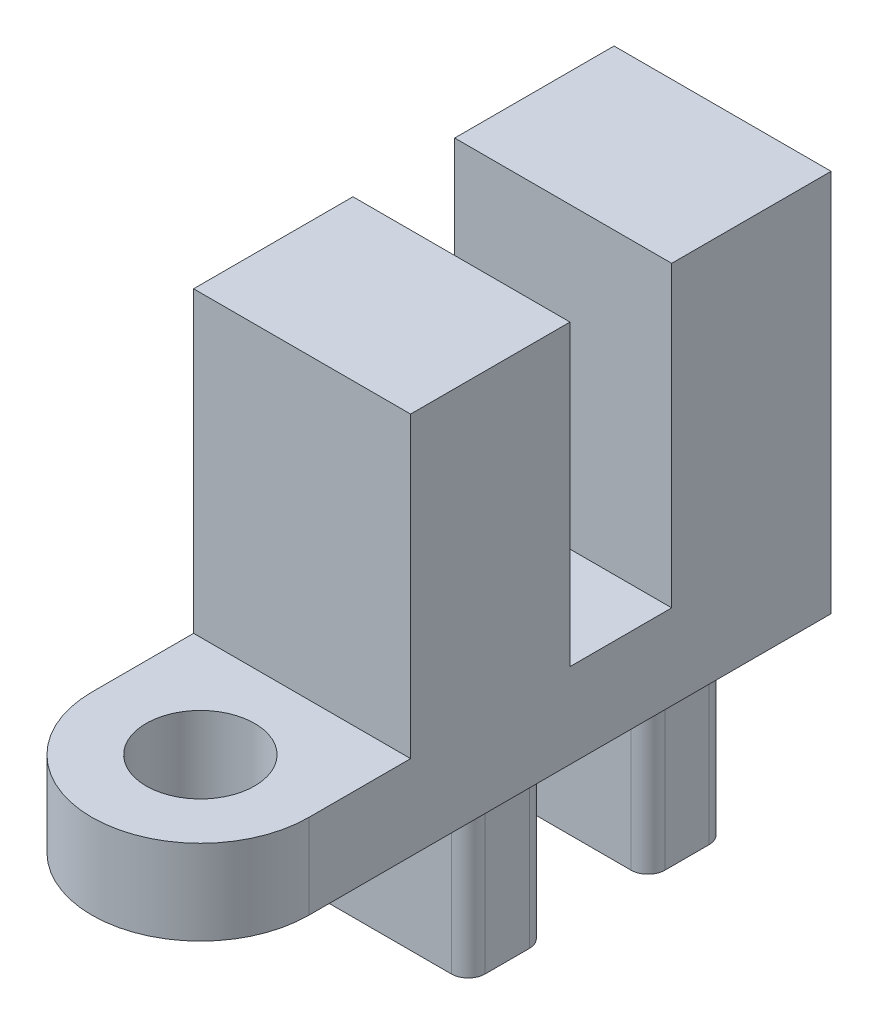
ISO-10303-21;
HEADER;
FILE_DESCRIPTION(('STEP AP214'),'2;1');
FILE_NAME('part.step','',(''),(''),'','','');
FILE_SCHEMA(('AUTOMOTIVE_DESIGN { 1 0 10303 214 1 1 1 1 }'));
ENDSEC;
DATA;
#1=APPLICATION_CONTEXT('core data for automotive mechanical design processes');
#2=APPLICATION_PROTOCOL_DEFINITION('international standard','automotive_design',2000,#1);
#3=PRODUCT_CONTEXT('',#1,'mechanical');
#4=PRODUCT('Part','Part','',(#3));
#5=PRODUCT_RELATED_PRODUCT_CATEGORY('part','',(#4));
#6=PRODUCT_DEFINITION_FORMATION('','',#4);
#7=PRODUCT_DEFINITION_CONTEXT('part definition',#1,'design');
#8=PRODUCT_DEFINITION('design','',#6,#7);
#9=PRODUCT_DEFINITION_SHAPE('','',#8);
#10=(LENGTH_UNIT() NAMED_UNIT(*) SI_UNIT(.MILLI.,.METRE.));
#11=(NAMED_UNIT(*) PLANE_ANGLE_UNIT() SI_UNIT($,.RADIAN.));
#12=(NAMED_UNIT(*) SI_UNIT($,.STERADIAN.) SOLID_ANGLE_UNIT());
#13=UNCERTAINTY_MEASURE_WITH_UNIT(LENGTH_MEASURE(1.E-05),#10,'distance_accuracy_value','');
#14=(GEOMETRIC_REPRESENTATION_CONTEXT(3) GLOBAL_UNCERTAINTY_ASSIGNED_CONTEXT((#13)) GLOBAL_UNIT_ASSIGNED_CONTEXT((#10,
#11,#12)) REPRESENTATION_CONTEXT('',''));
#15=CARTESIAN_POINT('',(0.,0.,0.));
#16=DIRECTION('',(0.,0.,1.));
#17=DIRECTION('',(1.,0.,0.));
#18=AXIS2_PLACEMENT_3D('',#15,#16,#17);
#19=CARTESIAN_POINT('',(0.,-2.5,9.2));
#20=DIRECTION('',(0.,-1.,0.));
#21=DIRECTION('',(0.,0.,-1.));
#22=AXIS2_PLACEMENT_3D('',#19,#20,#21);
#23=PLANE('',#22);
#24=DIRECTION('',(0.,0.,-1.));
#25=VECTOR('',#24,1.);
#26=CARTESIAN_POINT('',(-2.5,-2.5,3.29999999999999));
#27=LINE('',#26,#25);
#28=CARTESIAN_POINT('',(-2.5,-2.5,3.29999999999999));
#29=VERTEX_POINT('',#28);
#30=CARTESIAN_POINT('',(-2.5,-2.5,2.));
#31=VERTEX_POINT('',#30);
#32=EDGE_CURVE('E234',#29,#31,#27,.T.);
#33=ORIENTED_EDGE('',*,*,#32,.F.);
#34=CARTESIAN_POINT('',(-2.,-2.5,3.3));
#35=DIRECTION('',(0.,-1.,0.));
#36=DIRECTION('',(0.,0.,-1.));
#37=AXIS2_PLACEMENT_3D('',#34,#35,#36);
#38=CIRCLE('',#37,0.5);
#39=CARTESIAN_POINT('',(-2.,-2.5,3.8));
#40=VERTEX_POINT('',#39);
#41=EDGE_CURVE('E231',#40,#29,#38,.T.);
#42=ORIENTED_EDGE('',*,*,#41,.F.);
#43=DIRECTION('',(-1.,0.,0.));
#44=VECTOR('',#43,1.);
#45=CARTESIAN_POINT('',(-2.,-2.5,3.8));
#46=LINE('',#45,#44);
#47=CARTESIAN_POINT('',(2.,-2.5,3.8));
#48=VERTEX_POINT('',#47);
#49=EDGE_CURVE('E244',#48,#40,#46,.T.);
#50=ORIENTED_EDGE('',*,*,#49,.F.);
#51=CARTESIAN_POINT('',(2.,-2.5,3.3));
#52=DIRECTION('',(0.,-1.,0.));
#53=DIRECTION('',(0.,0.,1.));
#54=AXIS2_PLACEMENT_3D('',#51,#52,#53);
#55=CIRCLE('',#54,0.5);
#56=CARTESIAN_POINT('',(2.5,-2.5,3.29999999999999));
#57=VERTEX_POINT('',#56);
#58=EDGE_CURVE('E268',#57,#48,#55,.T.);
#59=ORIENTED_EDGE('',*,*,#58,.F.);
#60=DIRECTION('',(0.,0.,1.));
#61=VECTOR('',#60,1.);
#62=CARTESIAN_POINT('',(2.5,-2.5,3.29999999999999));
#63=LINE('',#62,#61);
#64=CARTESIAN_POINT('',(2.5,-2.5,2.));
#65=VERTEX_POINT('',#64);
#66=EDGE_CURVE('E266',#65,#57,#63,.T.);
#67=ORIENTED_EDGE('',*,*,#66,.F.);
#68=CARTESIAN_POINT('',(2.,-2.5,2.));
#69=DIRECTION('',(0.,-1.,0.));
#70=DIRECTION('',(0.,0.,-1.));
#71=AXIS2_PLACEMENT_3D('',#68,#69,#70);
#72=CIRCLE('',#71,0.5);
#73=CARTESIAN_POINT('',(2.,-2.5,1.5));
#74=VERTEX_POINT('',#73);
#75=EDGE_CURVE('E264',#74,#65,#72,.T.);
#76=ORIENTED_EDGE('',*,*,#75,.F.);
#77=DIRECTION('',(1.,0.,0.));
#78=VECTOR('',#77,1.);
#79=CARTESIAN_POINT('',(-2.,-2.5,1.5));
#80=LINE('',#79,#78);
#81=CARTESIAN_POINT('',(-2.,-2.5,1.5));
#82=VERTEX_POINT('',#81);
#83=EDGE_CURVE('E262',#82,#74,#80,.T.);
#84=ORIENTED_EDGE('',*,*,#83,.F.);
#85=CARTESIAN_POINT('',(-2.,-2.5,2.));
#86=DIRECTION('',(0.,-1.,0.));
#87=DIRECTION('',(0.,0.,-1.));
#88=AXIS2_PLACEMENT_3D('',#85,#86,#87);
#89=CIRCLE('',#88,0.5);
#90=EDGE_CURVE('E260',#31,#82,#89,.T.);
#91=ORIENTED_EDGE('',*,*,#90,.F.);
#92=EDGE_LOOP('',(#33,#42,#50,#59,#67,#76,#84,#91));
#93=FACE_BOUND('',#92,.T.);
#94=CARTESIAN_POINT('',(0.,-2.5,9.2));
#95=DIRECTION('',(0.,1.,0.));
#96=DIRECTION('',(0.,0.,1.));
#97=AXIS2_PLACEMENT_3D('',#94,#95,#96);
#98=CIRCLE('',#97,1.6);
#99=CARTESIAN_POINT('',(0.,-2.5,10.8));
#100=VERTEX_POINT('',#99);
#101=EDGE_CURVE('E333',#100,#100,#98,.T.);
#102=ORIENTED_EDGE('',*,*,#101,.T.);
#103=EDGE_LOOP('',(#102));
#104=FACE_BOUND('',#103,.T.);
#105=DIRECTION('',(0.,0.,1.));
#106=VECTOR('',#105,1.);
#107=CARTESIAN_POINT('',(-3.2,-2.5,9.2));
#108=LINE('',#107,#106);
#109=CARTESIAN_POINT('',(-3.2,-2.5,-6.2));
#110=VERTEX_POINT('',#109);
#111=CARTESIAN_POINT('',(-3.2,-2.5,9.2));
#112=VERTEX_POINT('',#111);
#113=EDGE_CURVE('E375',#110,#112,#108,.T.);
#114=ORIENTED_EDGE('',*,*,#113,.F.);
#115=DIRECTION('',(-1.,0.,0.));
#116=VECTOR('',#115,1.);
#117=CARTESIAN_POINT('',(-3.2,-2.5,-6.2));
#118=LINE('',#117,#116);
#119=CARTESIAN_POINT('',(3.2,-2.5,-6.2));
#120=VERTEX_POINT('',#119);
#121=EDGE_CURVE('E362',#120,#110,#118,.T.);
#122=ORIENTED_EDGE('',*,*,#121,.F.);
#123=DIRECTION('',(0.,0.,-1.));
#124=VECTOR('',#123,1.);
#125=CARTESIAN_POINT('',(3.2,-2.5,-6.2));
#126=LINE('',#125,#124);
#127=CARTESIAN_POINT('',(3.20000000000001,-2.5,9.2));
#128=VERTEX_POINT('',#127);
#129=EDGE_CURVE('E369',#128,#120,#126,.T.);
#130=ORIENTED_EDGE('',*,*,#129,.F.);
#131=CARTESIAN_POINT('',(0.,-2.5,9.2));
#132=DIRECTION('',(0.,1.,0.));
#133=DIRECTION('',(0.,0.,-1.));
#134=AXIS2_PLACEMENT_3D('',#131,#132,#133);
#135=CIRCLE('',#134,3.2);
#136=EDGE_CURVE('E372',#112,#128,#135,.T.);
#137=ORIENTED_EDGE('',*,*,#136,.F.);
#138=EDGE_LOOP('',(#114,#122,#130,#137));
#139=FACE_BOUND('',#138,.T.);
#140=DIRECTION('',(0.,0.,-1.));
#141=VECTOR('',#140,1.);
#142=CARTESIAN_POINT('',(-2.5,-2.5,-2.));
#143=LINE('',#142,#141);
#144=CARTESIAN_POINT('',(-2.5,-2.5,-2.));
#145=VERTEX_POINT('',#144);
#146=CARTESIAN_POINT('',(-2.5,-2.5,-3.3));
#147=VERTEX_POINT('',#146);
#148=EDGE_CURVE('E728',#145,#147,#143,.T.);
#149=ORIENTED_EDGE('',*,*,#148,.F.);
#150=CARTESIAN_POINT('',(-2.,-2.5,-2.));
#151=DIRECTION('',(0.,-1.,0.));
#152=DIRECTION('',(0.,0.,-1.));
#153=AXIS2_PLACEMENT_3D('',#150,#151,#152);
#154=CIRCLE('',#153,0.5);
#155=CARTESIAN_POINT('',(-2.,-2.5,-1.5));
#156=VERTEX_POINT('',#155);
#157=EDGE_CURVE('E229',#156,#145,#154,.T.);
#158=ORIENTED_EDGE('',*,*,#157,.F.);
#159=DIRECTION('',(-1.,0.,0.));
#160=VECTOR('',#159,1.);
#161=CARTESIAN_POINT('',(-2.,-2.5,-1.5));
#162=LINE('',#161,#160);
#163=CARTESIAN_POINT('',(2.,-2.5,-1.5));
#164=VERTEX_POINT('',#163);
#165=EDGE_CURVE('E225',#164,#156,#162,.T.);
#166=ORIENTED_EDGE('',*,*,#165,.F.);
#167=CARTESIAN_POINT('',(2.,-2.5,-2.));
#168=DIRECTION('',(0.,-1.,0.));
#169=DIRECTION('',(0.,0.,1.));
#170=AXIS2_PLACEMENT_3D('',#167,#168,#169);
#171=CIRCLE('',#170,0.5);
#172=CARTESIAN_POINT('',(2.5,-2.5,-2.));
#173=VERTEX_POINT('',#172);
#174=EDGE_CURVE('E724',#173,#164,#171,.T.);
#175=ORIENTED_EDGE('',*,*,#174,.F.);
#176=DIRECTION('',(0.,0.,1.));
#177=VECTOR('',#176,1.);
#178=CARTESIAN_POINT('',(2.5,-2.5,-2.));
#179=LINE('',#178,#177);
#180=CARTESIAN_POINT('',(2.5,-2.5,-3.3));
#181=VERTEX_POINT('',#180);
#182=EDGE_CURVE('E740',#181,#173,#179,.T.);
#183=ORIENTED_EDGE('',*,*,#182,.F.);
#184=CARTESIAN_POINT('',(2.,-2.5,-3.3));
#185=DIRECTION('',(0.,-1.,0.));
#186=DIRECTION('',(0.,0.,-1.));
#187=AXIS2_PLACEMENT_3D('',#184,#185,#186);
#188=CIRCLE('',#187,0.5);
#189=CARTESIAN_POINT('',(2.,-2.5,-3.8));
#190=VERTEX_POINT('',#189);
#191=EDGE_CURVE('E738',#190,#181,#188,.T.);
#192=ORIENTED_EDGE('',*,*,#191,.F.);
#193=DIRECTION('',(1.,0.,0.));
#194=VECTOR('',#193,1.);
#195=CARTESIAN_POINT('',(-2.,-2.5,-3.8));
#196=LINE('',#195,#194);
#197=CARTESIAN_POINT('',(-2.,-2.5,-3.8));
#198=VERTEX_POINT('',#197);
#199=EDGE_CURVE('E736',#198,#190,#196,.T.);
#200=ORIENTED_EDGE('',*,*,#199,.F.);
#201=CARTESIAN_POINT('',(-2.,-2.5,-3.3));
#202=DIRECTION('',(0.,-1.,0.));
#203=DIRECTION('',(0.,0.,-1.));
#204=AXIS2_PLACEMENT_3D('',#201,#202,#203);
#205=CIRCLE('',#204,0.5);
#206=EDGE_CURVE('E730',#147,#198,#205,.T.);
#207=ORIENTED_EDGE('',*,*,#206,.F.);
#208=EDGE_LOOP('',(#149,#158,#166,#175,#183,#192,#200,#207));
#209=FACE_BOUND('',#208,.T.);
#210=ADVANCED_FACE('F30',(#93,#104,#139,#209),#23,.T.);
#211=CARTESIAN_POINT('',(0.,0.,9.2));
#212=DIRECTION('',(0.,-1.,0.));
#213=DIRECTION('',(0.,0.,-1.));
#214=AXIS2_PLACEMENT_3D('',#211,#212,#213);
#215=PLANE('',#214);
#216=CARTESIAN_POINT('',(0.,0.,9.2));
#217=DIRECTION('',(0.,1.,0.));
#218=DIRECTION('',(0.,0.,1.));
#219=AXIS2_PLACEMENT_3D('',#216,#217,#218);
#220=CIRCLE('',#219,1.6);
#221=CARTESIAN_POINT('',(0.,0.,10.8));
#222=VERTEX_POINT('',#221);
#223=EDGE_CURVE('E349',#222,#222,#220,.T.);
#224=ORIENTED_EDGE('',*,*,#223,.F.);
#225=EDGE_LOOP('',(#224));
#226=FACE_BOUND('',#225,.T.);
#227=DIRECTION('',(1.,0.,0.));
#228=VECTOR('',#227,1.);
#229=CARTESIAN_POINT('',(-3.2,0.,6.2));
#230=LINE('',#229,#228);
#231=CARTESIAN_POINT('',(-3.2,0.,6.2));
#232=VERTEX_POINT('',#231);
#233=CARTESIAN_POINT('',(3.2,0.,6.2));
#234=VERTEX_POINT('',#233);
#235=EDGE_CURVE('E291',#232,#234,#230,.T.);
#236=ORIENTED_EDGE('',*,*,#235,.F.);
#237=DIRECTION('',(0.,0.,1.));
#238=VECTOR('',#237,1.);
#239=CARTESIAN_POINT('',(-3.2,0.,9.2));
#240=LINE('',#239,#238);
#241=CARTESIAN_POINT('',(-3.2,0.,9.2));
#242=VERTEX_POINT('',#241);
#243=EDGE_CURVE('E34',#232,#242,#240,.T.);
#244=ORIENTED_EDGE('',*,*,#243,.T.);
#245=CARTESIAN_POINT('',(0.,0.,9.2));
#246=DIRECTION('',(0.,1.,0.));
#247=DIRECTION('',(0.,0.,-1.));
#248=AXIS2_PLACEMENT_3D('',#245,#246,#247);
#249=CIRCLE('',#248,3.2);
#250=CARTESIAN_POINT('',(3.20000000000001,0.,9.2));
#251=VERTEX_POINT('',#250);
#252=EDGE_CURVE('E352',#242,#251,#249,.T.);
#253=ORIENTED_EDGE('',*,*,#252,.T.);
#254=DIRECTION('',(0.,0.,-1.));
#255=VECTOR('',#254,1.);
#256=CARTESIAN_POINT('',(3.2,0.,-6.2));
#257=LINE('',#256,#255);
#258=EDGE_CURVE('E339',#251,#234,#257,.T.);
#259=ORIENTED_EDGE('',*,*,#258,.T.);
#260=EDGE_LOOP('',(#236,#244,#253,#259));
#261=FACE_BOUND('',#260,.T.);
#262=ADVANCED_FACE('F386',(#226,#261),#215,.F.);
#263=DIRECTION('',(-1.,0.,0.));
#264=VECTOR('',#263,1.);
#265=CARTESIAN_POINT('',(-3.2,0.,1.5));
#266=LINE('',#265,#264);
#267=CARTESIAN_POINT('',(3.20000000000001,0.,1.5));
#268=VERTEX_POINT('',#267);
#269=CARTESIAN_POINT('',(-3.2,0.,1.5));
#270=VERTEX_POINT('',#269);
#271=EDGE_CURVE('E296',#268,#270,#266,.T.);
#272=ORIENTED_EDGE('',*,*,#271,.F.);
#273=CARTESIAN_POINT('',(3.20000000000001,0.,-1.5));
#274=VERTEX_POINT('',#273);
#275=EDGE_CURVE('E351',#268,#274,#257,.T.);
#276=ORIENTED_EDGE('',*,*,#275,.T.);
#277=DIRECTION('',(1.,0.,0.));
#278=VECTOR('',#277,1.);
#279=CARTESIAN_POINT('',(-3.2,0.,-1.5));
#280=LINE('',#279,#278);
#281=CARTESIAN_POINT('',(-3.2,0.,-1.5));
#282=VERTEX_POINT('',#281);
#283=EDGE_CURVE('E318',#282,#274,#280,.T.);
#284=ORIENTED_EDGE('',*,*,#283,.F.);
#285=EDGE_CURVE('E363',#282,#270,#240,.T.);
#286=ORIENTED_EDGE('',*,*,#285,.T.);
#287=EDGE_LOOP('',(#272,#276,#284,#286));
#288=FACE_BOUND('',#287,.T.);
#289=ADVANCED_FACE('F413',(#288),#215,.F.);
#290=CARTESIAN_POINT('',(-3.2,-2.5,9.2));
#291=DIRECTION('',(-1.,0.,0.));
#292=DIRECTION('',(0.,0.,1.));
#293=AXIS2_PLACEMENT_3D('',#290,#291,#292);
#294=PLANE('',#293);
#295=ORIENTED_EDGE('',*,*,#285,.F.);
#296=DIRECTION('',(0.,-1.,0.));
#297=VECTOR('',#296,1.);
#298=CARTESIAN_POINT('',(-3.2,8.8,-1.5));
#299=LINE('',#298,#297);
#300=CARTESIAN_POINT('',(-3.2,8.8,-1.5));
#301=VERTEX_POINT('',#300);
#302=EDGE_CURVE('E344',#301,#282,#299,.T.);
#303=ORIENTED_EDGE('',*,*,#302,.F.);
#304=DIRECTION('',(0.,0.,1.));
#305=VECTOR('',#304,1.);
#306=CARTESIAN_POINT('',(-3.2,8.8,-6.2));
#307=LINE('',#306,#305);
#308=CARTESIAN_POINT('',(-3.2,8.8,-6.2));
#309=VERTEX_POINT('',#308);
#310=EDGE_CURVE('E319',#309,#301,#307,.T.);
#311=ORIENTED_EDGE('',*,*,#310,.F.);
#312=DIRECTION('',(0.,1.,0.));
#313=VECTOR('',#312,1.);
#314=CARTESIAN_POINT('',(-3.2,-2.5,-6.2));
#315=LINE('',#314,#313);
#316=EDGE_CURVE('E11',#110,#309,#315,.T.);
#317=ORIENTED_EDGE('',*,*,#316,.F.);
#318=ORIENTED_EDGE('',*,*,#113,.T.);
#319=DIRECTION('',(0.,1.,0.));
#320=VECTOR('',#319,1.);
#321=CARTESIAN_POINT('',(-3.2,-2.5,9.2));
#322=LINE('',#321,#320);
#323=EDGE_CURVE('E360',#112,#242,#322,.T.);
#324=ORIENTED_EDGE('',*,*,#323,.T.);
#325=ORIENTED_EDGE('',*,*,#243,.F.);
#326=DIRECTION('',(0.,-1.,0.));
#327=VECTOR('',#326,1.);
#328=CARTESIAN_POINT('',(-3.2,8.8,6.2));
#329=LINE('',#328,#327);
#330=CARTESIAN_POINT('',(-3.2,8.8,6.2));
#331=VERTEX_POINT('',#330);
#332=EDGE_CURVE('E315',#331,#232,#329,.T.);
#333=ORIENTED_EDGE('',*,*,#332,.F.);
#334=DIRECTION('',(0.,0.,1.));
#335=VECTOR('',#334,1.);
#336=CARTESIAN_POINT('',(-3.2,8.8,1.5));
#337=LINE('',#336,#335);
#338=CARTESIAN_POINT('',(-3.2,8.8,1.5));
#339=VERTEX_POINT('',#338);
#340=EDGE_CURVE('E292',#339,#331,#337,.T.);
#341=ORIENTED_EDGE('',*,*,#340,.F.);
#342=DIRECTION('',(0.,-1.,0.));
#343=VECTOR('',#342,1.);
#344=CARTESIAN_POINT('',(-3.2,8.8,1.5));
#345=LINE('',#344,#343);
#346=EDGE_CURVE('E302',#339,#270,#345,.T.);
#347=ORIENTED_EDGE('',*,*,#346,.T.);
#348=EDGE_LOOP('',(#295,#303,#311,#317,#318,#324,#325,#333,#341,#347));
#349=FACE_BOUND('',#348,.T.);
#350=ADVANCED_FACE('F32',(#349),#294,.T.);
#351=CARTESIAN_POINT('',(-3.2,-2.5,-6.2));
#352=DIRECTION('',(0.,0.,-1.));
#353=DIRECTION('',(-1.,0.,0.));
#354=AXIS2_PLACEMENT_3D('',#351,#352,#353);
#355=PLANE('',#354);
#356=ORIENTED_EDGE('',*,*,#316,.T.);
#357=DIRECTION('',(-1.,0.,0.));
#358=VECTOR('',#357,1.);
#359=CARTESIAN_POINT('',(-3.2,8.8,-6.2));
#360=LINE('',#359,#358);
#361=CARTESIAN_POINT('',(3.20000000000001,8.8,-6.2));
#362=VERTEX_POINT('',#361);
#363=EDGE_CURVE('E327',#362,#309,#360,.T.);
#364=ORIENTED_EDGE('',*,*,#363,.F.);
#365=DIRECTION('',(0.,1.,0.));
#366=VECTOR('',#365,1.);
#367=CARTESIAN_POINT('',(3.2,-2.5,-6.2));
#368=LINE('',#367,#366);
#369=EDGE_CURVE('E40',#120,#362,#368,.T.);
#370=ORIENTED_EDGE('',*,*,#369,.F.);
#371=ORIENTED_EDGE('',*,*,#121,.T.);
#372=EDGE_LOOP('',(#356,#364,#370,#371));
#373=FACE_BOUND('',#372,.T.);
#374=ADVANCED_FACE('F427',(#373),#355,.T.);
#375=CARTESIAN_POINT('',(3.2,-2.5,-6.2));
#376=DIRECTION('',(1.,0.,0.));
#377=DIRECTION('',(0.,0.,-1.));
#378=AXIS2_PLACEMENT_3D('',#375,#376,#377);
#379=PLANE('',#378);
#380=ORIENTED_EDGE('',*,*,#258,.F.);
#381=DIRECTION('',(0.,1.,0.));
#382=VECTOR('',#381,1.);
#383=CARTESIAN_POINT('',(3.20000000000001,-2.5,9.2));
#384=LINE('',#383,#382);
#385=EDGE_CURVE('E358',#128,#251,#384,.T.);
#386=ORIENTED_EDGE('',*,*,#385,.F.);
#387=ORIENTED_EDGE('',*,*,#129,.T.);
#388=ORIENTED_EDGE('',*,*,#369,.T.);
#389=DIRECTION('',(0.,0.,-1.));
#390=VECTOR('',#389,1.);
#391=CARTESIAN_POINT('',(3.20000000000001,8.8,-6.2));
#392=LINE('',#391,#390);
#393=CARTESIAN_POINT('',(3.20000000000001,8.8,-1.5));
#394=VERTEX_POINT('',#393);
#395=EDGE_CURVE('E324',#394,#362,#392,.T.);
#396=ORIENTED_EDGE('',*,*,#395,.F.);
#397=DIRECTION('',(0.,-1.,0.));
#398=VECTOR('',#397,1.);
#399=CARTESIAN_POINT('',(3.20000000000001,8.8,-1.5));
#400=LINE('',#399,#398);
#401=EDGE_CURVE('E330',#394,#274,#400,.T.);
#402=ORIENTED_EDGE('',*,*,#401,.T.);
#403=ORIENTED_EDGE('',*,*,#275,.F.);
#404=DIRECTION('',(0.,-1.,0.));
#405=VECTOR('',#404,1.);
#406=CARTESIAN_POINT('',(3.20000000000001,8.8,1.5));
#407=LINE('',#406,#405);
#408=CARTESIAN_POINT('',(3.20000000000001,8.8,1.5));
#409=VERTEX_POINT('',#408);
#410=EDGE_CURVE('E309',#409,#268,#407,.T.);
#411=ORIENTED_EDGE('',*,*,#410,.F.);
#412=DIRECTION('',(0.,0.,-1.));
#413=VECTOR('',#412,1.);
#414=CARTESIAN_POINT('',(3.20000000000001,8.8,1.5));
#415=LINE('',#414,#413);
#416=CARTESIAN_POINT('',(3.20000000000001,8.8,6.2));
#417=VERTEX_POINT('',#416);
#418=EDGE_CURVE('E298',#417,#409,#415,.T.);
#419=ORIENTED_EDGE('',*,*,#418,.F.);
#420=DIRECTION('',(0.,-1.,0.));
#421=VECTOR('',#420,1.);
#422=CARTESIAN_POINT('',(3.20000000000001,8.8,6.2));
#423=LINE('',#422,#421);
#424=EDGE_CURVE('E312',#417,#234,#423,.T.);
#425=ORIENTED_EDGE('',*,*,#424,.T.);
#426=EDGE_LOOP('',(#380,#386,#387,#388,#396,#402,#403,#411,#419,#425));
#427=FACE_BOUND('',#426,.T.);
#428=ADVANCED_FACE('F398',(#427),#379,.T.);
#429=CARTESIAN_POINT('',(0.,-2.5,9.2));
#430=DIRECTION('',(0.,1.,0.));
#431=DIRECTION('',(0.,0.,1.));
#432=AXIS2_PLACEMENT_3D('',#429,#430,#431);
#433=CYLINDRICAL_SURFACE('',#432,3.2);
#434=ORIENTED_EDGE('',*,*,#252,.F.);
#435=ORIENTED_EDGE('',*,*,#323,.F.);
#436=ORIENTED_EDGE('',*,*,#136,.T.);
#437=ORIENTED_EDGE('',*,*,#385,.T.);
#438=EDGE_LOOP('',(#434,#435,#436,#437));
#439=FACE_BOUND('',#438,.T.);
#440=ADVANCED_FACE('F394',(#439),#433,.T.);
#441=CARTESIAN_POINT('',(0.,-2.5,9.2));
#442=DIRECTION('',(0.,1.,0.));
#443=DIRECTION('',(0.,0.,1.));
#444=AXIS2_PLACEMENT_3D('',#441,#442,#443);
#445=CYLINDRICAL_SURFACE('',#444,1.6);
#446=ORIENTED_EDGE('',*,*,#101,.F.);
#447=EDGE_LOOP('',(#446));
#448=FACE_BOUND('',#447,.T.);
#449=ORIENTED_EDGE('',*,*,#223,.T.);
#450=EDGE_LOOP('',(#449));
#451=FACE_BOUND('',#450,.T.);
#452=ADVANCED_FACE('F445',(#448,#451),#445,.F.);
#453=CARTESIAN_POINT('',(-3.2,8.8,-1.5));
#454=DIRECTION('',(0.,0.,-1.));
#455=DIRECTION('',(-1.,0.,0.));
#456=AXIS2_PLACEMENT_3D('',#453,#454,#455);
#457=PLANE('',#456);
#458=ORIENTED_EDGE('',*,*,#283,.T.);
#459=ORIENTED_EDGE('',*,*,#401,.F.);
#460=DIRECTION('',(1.,0.,0.));
#461=VECTOR('',#460,1.);
#462=CARTESIAN_POINT('',(-3.2,8.8,-1.5));
#463=LINE('',#462,#461);
#464=EDGE_CURVE('E322',#301,#394,#463,.T.);
#465=ORIENTED_EDGE('',*,*,#464,.F.);
#466=ORIENTED_EDGE('',*,*,#302,.T.);
#467=EDGE_LOOP('',(#458,#459,#465,#466));
#468=FACE_BOUND('',#467,.T.);
#469=ADVANCED_FACE('F417',(#468),#457,.F.);
#470=CARTESIAN_POINT('',(-3.2,8.8,-6.2));
#471=DIRECTION('',(0.,1.,0.));
#472=DIRECTION('',(0.,0.,1.));
#473=AXIS2_PLACEMENT_3D('',#470,#471,#472);
#474=PLANE('',#473);
#475=ORIENTED_EDGE('',*,*,#310,.T.);
#476=ORIENTED_EDGE('',*,*,#464,.T.);
#477=ORIENTED_EDGE('',*,*,#395,.T.);
#478=ORIENTED_EDGE('',*,*,#363,.T.);
#479=EDGE_LOOP('',(#475,#476,#477,#478));
#480=FACE_BOUND('',#479,.T.);
#481=ADVANCED_FACE('F421',(#480),#474,.T.);
#482=CARTESIAN_POINT('',(-3.2,8.8,6.2));
#483=DIRECTION('',(0.,0.,-1.));
#484=DIRECTION('',(-1.,0.,0.));
#485=AXIS2_PLACEMENT_3D('',#482,#483,#484);
#486=PLANE('',#485);
#487=ORIENTED_EDGE('',*,*,#235,.T.);
#488=ORIENTED_EDGE('',*,*,#424,.F.);
#489=DIRECTION('',(1.,0.,0.));
#490=VECTOR('',#489,1.);
#491=CARTESIAN_POINT('',(-3.2,8.8,6.2));
#492=LINE('',#491,#490);
#493=EDGE_CURVE('E295',#331,#417,#492,.T.);
#494=ORIENTED_EDGE('',*,*,#493,.F.);
#495=ORIENTED_EDGE('',*,*,#332,.T.);
#496=EDGE_LOOP('',(#487,#488,#494,#495));
#497=FACE_BOUND('',#496,.T.);
#498=ADVANCED_FACE('F402',(#497),#486,.F.);
#499=CARTESIAN_POINT('',(-3.2,8.8,1.5));
#500=DIRECTION('',(0.,0.,1.));
#501=DIRECTION('',(1.,0.,0.));
#502=AXIS2_PLACEMENT_3D('',#499,#500,#501);
#503=PLANE('',#502);
#504=ORIENTED_EDGE('',*,*,#271,.T.);
#505=ORIENTED_EDGE('',*,*,#346,.F.);
#506=DIRECTION('',(-1.,0.,0.));
#507=VECTOR('',#506,1.);
#508=CARTESIAN_POINT('',(-3.2,8.8,1.5));
#509=LINE('',#508,#507);
#510=EDGE_CURVE('E300',#409,#339,#509,.T.);
#511=ORIENTED_EDGE('',*,*,#510,.F.);
#512=ORIENTED_EDGE('',*,*,#410,.T.);
#513=EDGE_LOOP('',(#504,#505,#511,#512));
#514=FACE_BOUND('',#513,.T.);
#515=ADVANCED_FACE('F410',(#514),#503,.F.);
#516=CARTESIAN_POINT('',(-3.2,8.8,6.2));
#517=DIRECTION('',(0.,1.,0.));
#518=DIRECTION('',(0.,0.,1.));
#519=AXIS2_PLACEMENT_3D('',#516,#517,#518);
#520=PLANE('',#519);
#521=ORIENTED_EDGE('',*,*,#340,.T.);
#522=ORIENTED_EDGE('',*,*,#493,.T.);
#523=ORIENTED_EDGE('',*,*,#418,.T.);
#524=ORIENTED_EDGE('',*,*,#510,.T.);
#525=EDGE_LOOP('',(#521,#522,#523,#524));
#526=FACE_BOUND('',#525,.T.);
#527=ADVANCED_FACE('F406',(#526),#520,.T.);
#528=CARTESIAN_POINT('',(-2.,-7.3,3.3));
#529=DIRECTION('',(0.,1.,0.));
#530=DIRECTION('',(0.,0.,1.));
#531=AXIS2_PLACEMENT_3D('',#528,#529,#530);
#532=CYLINDRICAL_SURFACE('',#531,0.5);
#533=ORIENTED_EDGE('',*,*,#41,.T.);
#534=DIRECTION('',(0.,1.,0.));
#535=VECTOR('',#534,1.);
#536=CARTESIAN_POINT('',(-2.5,-7.3,3.29999999999999));
#537=LINE('',#536,#535);
#538=CARTESIAN_POINT('',(-2.5,-7.3,3.29999999999999));
#539=VERTEX_POINT('',#538);
#540=EDGE_CURVE('E289',#539,#29,#537,.T.);
#541=ORIENTED_EDGE('',*,*,#540,.F.);
#542=CARTESIAN_POINT('',(-2.,-7.3,3.3));
#543=DIRECTION('',(0.,-1.,0.));
#544=DIRECTION('',(0.,0.,-1.));
#545=AXIS2_PLACEMENT_3D('',#542,#543,#544);
#546=CIRCLE('',#545,0.5);
#547=CARTESIAN_POINT('',(-2.,-7.3,3.8));
#548=VERTEX_POINT('',#547);
#549=EDGE_CURVE('E240',#548,#539,#546,.T.);
#550=ORIENTED_EDGE('',*,*,#549,.F.);
#551=DIRECTION('',(0.,1.,0.));
#552=VECTOR('',#551,1.);
#553=CARTESIAN_POINT('',(-2.,-7.3,3.8));
#554=LINE('',#553,#552);
#555=EDGE_CURVE('E257',#548,#40,#554,.T.);
#556=ORIENTED_EDGE('',*,*,#555,.T.);
#557=EDGE_LOOP('',(#533,#541,#550,#556));
#558=FACE_BOUND('',#557,.T.);
#559=ADVANCED_FACE('F459',(#558),#532,.T.);
#560=CARTESIAN_POINT('',(-2.5,-7.3,3.29999999999999));
#561=DIRECTION('',(1.,0.,0.));
#562=DIRECTION('',(0.,0.,-1.));
#563=AXIS2_PLACEMENT_3D('',#560,#561,#562);
#564=PLANE('',#563);
#565=ORIENTED_EDGE('',*,*,#32,.T.);
#566=DIRECTION('',(0.,1.,0.));
#567=VECTOR('',#566,1.);
#568=CARTESIAN_POINT('',(-2.5,-7.3,2.));
#569=LINE('',#568,#567);
#570=CARTESIAN_POINT('',(-2.5,-7.3,2.));
#571=VERTEX_POINT('',#570);
#572=EDGE_CURVE('E286',#571,#31,#569,.T.);
#573=ORIENTED_EDGE('',*,*,#572,.F.);
#574=DIRECTION('',(0.,0.,-1.));
#575=VECTOR('',#574,1.);
#576=CARTESIAN_POINT('',(-2.5,-7.3,3.29999999999999));
#577=LINE('',#576,#575);
#578=EDGE_CURVE('E243',#539,#571,#577,.T.);
#579=ORIENTED_EDGE('',*,*,#578,.F.);
#580=ORIENTED_EDGE('',*,*,#540,.T.);
#581=EDGE_LOOP('',(#565,#573,#579,#580));
#582=FACE_BOUND('',#581,.T.);
#583=ADVANCED_FACE('F462',(#582),#564,.F.);
#584=CARTESIAN_POINT('',(-2.,-7.3,2.));
#585=DIRECTION('',(0.,1.,0.));
#586=DIRECTION('',(0.,0.,1.));
#587=AXIS2_PLACEMENT_3D('',#584,#585,#586);
#588=CYLINDRICAL_SURFACE('',#587,0.5);
#589=ORIENTED_EDGE('',*,*,#90,.T.);
#590=DIRECTION('',(0.,1.,0.));
#591=VECTOR('',#590,1.);
#592=CARTESIAN_POINT('',(-2.,-7.3,1.5));
#593=LINE('',#592,#591);
#594=CARTESIAN_POINT('',(-2.,-7.3,1.5));
#595=VERTEX_POINT('',#594);
#596=EDGE_CURVE('E283',#595,#82,#593,.T.);
#597=ORIENTED_EDGE('',*,*,#596,.F.);
#598=CARTESIAN_POINT('',(-2.,-7.3,2.));
#599=DIRECTION('',(0.,-1.,0.));
#600=DIRECTION('',(0.,0.,-1.));
#601=AXIS2_PLACEMENT_3D('',#598,#599,#600);
#602=CIRCLE('',#601,0.5);
#603=EDGE_CURVE('E246',#571,#595,#602,.T.);
#604=ORIENTED_EDGE('',*,*,#603,.F.);
#605=ORIENTED_EDGE('',*,*,#572,.T.);
#606=EDGE_LOOP('',(#589,#597,#604,#605));
#607=FACE_BOUND('',#606,.T.);
#608=ADVANCED_FACE('F466',(#607),#588,.T.);
#609=CARTESIAN_POINT('',(-2.,-7.3,1.5));
#610=DIRECTION('',(0.,0.,1.));
#611=DIRECTION('',(1.,0.,0.));
#612=AXIS2_PLACEMENT_3D('',#609,#610,#611);
#613=PLANE('',#612);
#614=ORIENTED_EDGE('',*,*,#83,.T.);
#615=DIRECTION('',(0.,1.,0.));
#616=VECTOR('',#615,1.);
#617=CARTESIAN_POINT('',(2.,-7.3,1.5));
#618=LINE('',#617,#616);
#619=CARTESIAN_POINT('',(2.,-7.3,1.5));
#620=VERTEX_POINT('',#619);
#621=EDGE_CURVE('E280',#620,#74,#618,.T.);
#622=ORIENTED_EDGE('',*,*,#621,.F.);
#623=DIRECTION('',(1.,0.,0.));
#624=VECTOR('',#623,1.);
#625=CARTESIAN_POINT('',(-2.,-7.3,1.5));
#626=LINE('',#625,#624);
#627=EDGE_CURVE('E248',#595,#620,#626,.T.);
#628=ORIENTED_EDGE('',*,*,#627,.F.);
#629=ORIENTED_EDGE('',*,*,#596,.T.);
#630=EDGE_LOOP('',(#614,#622,#628,#629));
#631=FACE_BOUND('',#630,.T.);
#632=ADVANCED_FACE('F470',(#631),#613,.F.);
#633=CARTESIAN_POINT('',(2.,-7.3,2.));
#634=DIRECTION('',(0.,1.,0.));
#635=DIRECTION('',(0.,0.,1.));
#636=AXIS2_PLACEMENT_3D('',#633,#634,#635);
#637=CYLINDRICAL_SURFACE('',#636,0.5);
#638=ORIENTED_EDGE('',*,*,#75,.T.);
#639=DIRECTION('',(0.,1.,0.));
#640=VECTOR('',#639,1.);
#641=CARTESIAN_POINT('',(2.5,-7.3,2.));
#642=LINE('',#641,#640);
#643=CARTESIAN_POINT('',(2.5,-7.3,2.));
#644=VERTEX_POINT('',#643);
#645=EDGE_CURVE('E277',#644,#65,#642,.T.);
#646=ORIENTED_EDGE('',*,*,#645,.F.);
#647=CARTESIAN_POINT('',(2.,-7.3,2.));
#648=DIRECTION('',(0.,-1.,0.));
#649=DIRECTION('',(0.,0.,-1.));
#650=AXIS2_PLACEMENT_3D('',#647,#648,#649);
#651=CIRCLE('',#650,0.5);
#652=EDGE_CURVE('E250',#620,#644,#651,.T.);
#653=ORIENTED_EDGE('',*,*,#652,.F.);
#654=ORIENTED_EDGE('',*,*,#621,.T.);
#655=EDGE_LOOP('',(#638,#646,#653,#654));
#656=FACE_BOUND('',#655,.T.);
#657=ADVANCED_FACE('F474',(#656),#637,.T.);
#658=CARTESIAN_POINT('',(2.5,-7.3,3.29999999999999));
#659=DIRECTION('',(-1.,0.,0.));
#660=DIRECTION('',(0.,0.,1.));
#661=AXIS2_PLACEMENT_3D('',#658,#659,#660);
#662=PLANE('',#661);
#663=ORIENTED_EDGE('',*,*,#66,.T.);
#664=DIRECTION('',(0.,1.,0.));
#665=VECTOR('',#664,1.);
#666=CARTESIAN_POINT('',(2.5,-7.3,3.29999999999999));
#667=LINE('',#666,#665);
#668=CARTESIAN_POINT('',(2.5,-7.3,3.29999999999999));
#669=VERTEX_POINT('',#668);
#670=EDGE_CURVE('E274',#669,#57,#667,.T.);
#671=ORIENTED_EDGE('',*,*,#670,.F.);
#672=DIRECTION('',(0.,0.,1.));
#673=VECTOR('',#672,1.);
#674=CARTESIAN_POINT('',(2.5,-7.3,3.29999999999999));
#675=LINE('',#674,#673);
#676=EDGE_CURVE('E252',#644,#669,#675,.T.);
#677=ORIENTED_EDGE('',*,*,#676,.F.);
#678=ORIENTED_EDGE('',*,*,#645,.T.);
#679=EDGE_LOOP('',(#663,#671,#677,#678));
#680=FACE_BOUND('',#679,.T.);
#681=ADVANCED_FACE('F478',(#680),#662,.F.);
#682=CARTESIAN_POINT('',(2.,-7.3,3.3));
#683=DIRECTION('',(0.,1.,0.));
#684=DIRECTION('',(0.,0.,1.));
#685=AXIS2_PLACEMENT_3D('',#682,#683,#684);
#686=CYLINDRICAL_SURFACE('',#685,0.5);
#687=ORIENTED_EDGE('',*,*,#58,.T.);
#688=DIRECTION('',(0.,1.,0.));
#689=VECTOR('',#688,1.);
#690=CARTESIAN_POINT('',(2.,-7.3,3.8));
#691=LINE('',#690,#689);
#692=CARTESIAN_POINT('',(2.,-7.3,3.8));
#693=VERTEX_POINT('',#692);
#694=EDGE_CURVE('E56',#693,#48,#691,.T.);
#695=ORIENTED_EDGE('',*,*,#694,.F.);
#696=CARTESIAN_POINT('',(2.,-7.3,3.3));
#697=DIRECTION('',(0.,-1.,0.));
#698=DIRECTION('',(0.,0.,1.));
#699=AXIS2_PLACEMENT_3D('',#696,#697,#698);
#700=CIRCLE('',#699,0.5);
#701=EDGE_CURVE('E254',#669,#693,#700,.T.);
#702=ORIENTED_EDGE('',*,*,#701,.F.);
#703=ORIENTED_EDGE('',*,*,#670,.T.);
#704=EDGE_LOOP('',(#687,#695,#702,#703));
#705=FACE_BOUND('',#704,.T.);
#706=ADVANCED_FACE('F482',(#705),#686,.T.);
#707=CARTESIAN_POINT('',(-2.,-7.3,3.8));
#708=DIRECTION('',(0.,0.,-1.));
#709=DIRECTION('',(-1.,0.,0.));
#710=AXIS2_PLACEMENT_3D('',#707,#708,#709);
#711=PLANE('',#710);
#712=ORIENTED_EDGE('',*,*,#49,.T.);
#713=ORIENTED_EDGE('',*,*,#555,.F.);
#714=DIRECTION('',(-1.,0.,0.));
#715=VECTOR('',#714,1.);
#716=CARTESIAN_POINT('',(-2.,-7.3,3.8));
#717=LINE('',#716,#715);
#718=EDGE_CURVE('E256',#693,#548,#717,.T.);
#719=ORIENTED_EDGE('',*,*,#718,.F.);
#720=ORIENTED_EDGE('',*,*,#694,.T.);
#721=EDGE_LOOP('',(#712,#713,#719,#720));
#722=FACE_BOUND('',#721,.T.);
#723=ADVANCED_FACE('F486',(#722),#711,.F.);
#724=CARTESIAN_POINT('',(-2.,-7.3,3.3));
#725=DIRECTION('',(0.,-1.,0.));
#726=DIRECTION('',(0.,0.,-1.));
#727=AXIS2_PLACEMENT_3D('',#724,#725,#726);
#728=PLANE('',#727);
#729=ORIENTED_EDGE('',*,*,#549,.T.);
#730=ORIENTED_EDGE('',*,*,#578,.T.);
#731=ORIENTED_EDGE('',*,*,#603,.T.);
#732=ORIENTED_EDGE('',*,*,#627,.T.);
#733=ORIENTED_EDGE('',*,*,#652,.T.);
#734=ORIENTED_EDGE('',*,*,#676,.T.);
#735=ORIENTED_EDGE('',*,*,#701,.T.);
#736=ORIENTED_EDGE('',*,*,#718,.T.);
#737=EDGE_LOOP('',(#729,#730,#731,#732,#733,#734,#735,#736));
#738=FACE_BOUND('',#737,.T.);
#739=ADVANCED_FACE('F490',(#738),#728,.T.);
#740=CARTESIAN_POINT('',(-2.,-7.3,-2.));
#741=DIRECTION('',(0.,1.,0.));
#742=DIRECTION('',(0.,0.,1.));
#743=AXIS2_PLACEMENT_3D('',#740,#741,#742);
#744=CYLINDRICAL_SURFACE('',#743,0.5);
#745=ORIENTED_EDGE('',*,*,#157,.T.);
#746=DIRECTION('',(0.,1.,0.));
#747=VECTOR('',#746,1.);
#748=CARTESIAN_POINT('',(-2.5,-7.3,-2.));
#749=LINE('',#748,#747);
#750=CARTESIAN_POINT('',(-2.5,-7.3,-2.));
#751=VERTEX_POINT('',#750);
#752=EDGE_CURVE('E210',#751,#145,#749,.T.);
#753=ORIENTED_EDGE('',*,*,#752,.F.);
#754=CARTESIAN_POINT('',(-2.,-7.3,-2.));
#755=DIRECTION('',(0.,-1.,0.));
#756=DIRECTION('',(0.,0.,-1.));
#757=AXIS2_PLACEMENT_3D('',#754,#755,#756);
#758=CIRCLE('',#757,0.5);
#759=CARTESIAN_POINT('',(-2.,-7.3,-1.5));
#760=VERTEX_POINT('',#759);
#761=EDGE_CURVE('E217',#760,#751,#758,.T.);
#762=ORIENTED_EDGE('',*,*,#761,.F.);
#763=DIRECTION('',(0.,1.,0.));
#764=VECTOR('',#763,1.);
#765=CARTESIAN_POINT('',(-2.,-7.3,-1.5));
#766=LINE('',#765,#764);
#767=EDGE_CURVE('E722',#760,#156,#766,.T.);
#768=ORIENTED_EDGE('',*,*,#767,.T.);
#769=EDGE_LOOP('',(#745,#753,#762,#768));
#770=FACE_BOUND('',#769,.T.);
#771=ADVANCED_FACE('F227',(#770),#744,.T.);
#772=CARTESIAN_POINT('',(-2.5,-7.3,-2.));
#773=DIRECTION('',(1.,0.,0.));
#774=DIRECTION('',(0.,0.,-1.));
#775=AXIS2_PLACEMENT_3D('',#772,#773,#774);
#776=PLANE('',#775);
#777=ORIENTED_EDGE('',*,*,#148,.T.);
#778=DIRECTION('',(0.,1.,0.));
#779=VECTOR('',#778,1.);
#780=CARTESIAN_POINT('',(-2.5,-7.3,-3.3));
#781=LINE('',#780,#779);
#782=CARTESIAN_POINT('',(-2.5,-7.3,-3.3));
#783=VERTEX_POINT('',#782);
#784=EDGE_CURVE('E213',#783,#147,#781,.T.);
#785=ORIENTED_EDGE('',*,*,#784,.F.);
#786=DIRECTION('',(0.,0.,-1.));
#787=VECTOR('',#786,1.);
#788=CARTESIAN_POINT('',(-2.5,-7.3,-2.));
#789=LINE('',#788,#787);
#790=EDGE_CURVE('E206',#751,#783,#789,.T.);
#791=ORIENTED_EDGE('',*,*,#790,.F.);
#792=ORIENTED_EDGE('',*,*,#752,.T.);
#793=EDGE_LOOP('',(#777,#785,#791,#792));
#794=FACE_BOUND('',#793,.T.);
#795=ADVANCED_FACE('F208',(#794),#776,.F.);
#796=CARTESIAN_POINT('',(-2.,-7.3,-3.3));
#797=DIRECTION('',(0.,1.,0.));
#798=DIRECTION('',(0.,0.,1.));
#799=AXIS2_PLACEMENT_3D('',#796,#797,#798);
#800=CYLINDRICAL_SURFACE('',#799,0.5);
#801=ORIENTED_EDGE('',*,*,#206,.T.);
#802=DIRECTION('',(0.,1.,0.));
#803=VECTOR('',#802,1.);
#804=CARTESIAN_POINT('',(-2.,-7.3,-3.8));
#805=LINE('',#804,#803);
#806=CARTESIAN_POINT('',(-2.,-7.3,-3.8));
#807=VERTEX_POINT('',#806);
#808=EDGE_CURVE('E236',#807,#198,#805,.T.);
#809=ORIENTED_EDGE('',*,*,#808,.F.);
#810=CARTESIAN_POINT('',(-2.,-7.3,-3.3));
#811=DIRECTION('',(0.,-1.,0.));
#812=DIRECTION('',(0.,0.,-1.));
#813=AXIS2_PLACEMENT_3D('',#810,#811,#812);
#814=CIRCLE('',#813,0.5);
#815=EDGE_CURVE('E216',#783,#807,#814,.T.);
#816=ORIENTED_EDGE('',*,*,#815,.F.);
#817=ORIENTED_EDGE('',*,*,#784,.T.);
#818=EDGE_LOOP('',(#801,#809,#816,#817));
#819=FACE_BOUND('',#818,.T.);
#820=ADVANCED_FACE('F498',(#819),#800,.T.);
#821=CARTESIAN_POINT('',(-2.,-7.3,-3.8));
#822=DIRECTION('',(0.,0.,1.));
#823=DIRECTION('',(1.,0.,0.));
#824=AXIS2_PLACEMENT_3D('',#821,#822,#823);
#825=PLANE('',#824);
#826=ORIENTED_EDGE('',*,*,#199,.T.);
#827=DIRECTION('',(0.,1.,0.));
#828=VECTOR('',#827,1.);
#829=CARTESIAN_POINT('',(2.,-7.3,-3.8));
#830=LINE('',#829,#828);
#831=CARTESIAN_POINT('',(2.,-7.3,-3.8));
#832=VERTEX_POINT('',#831);
#833=EDGE_CURVE('E750',#832,#190,#830,.T.);
#834=ORIENTED_EDGE('',*,*,#833,.F.);
#835=DIRECTION('',(1.,0.,0.));
#836=VECTOR('',#835,1.);
#837=CARTESIAN_POINT('',(-2.,-7.3,-3.8));
#838=LINE('',#837,#836);
#839=EDGE_CURVE('E757',#807,#832,#838,.T.);
#840=ORIENTED_EDGE('',*,*,#839,.F.);
#841=ORIENTED_EDGE('',*,*,#808,.T.);
#842=EDGE_LOOP('',(#826,#834,#840,#841));
#843=FACE_BOUND('',#842,.T.);
#844=ADVANCED_FACE('F501',(#843),#825,.F.);
#845=CARTESIAN_POINT('',(2.,-7.3,-3.3));
#846=DIRECTION('',(0.,1.,0.));
#847=DIRECTION('',(0.,0.,1.));
#848=AXIS2_PLACEMENT_3D('',#845,#846,#847);
#849=CYLINDRICAL_SURFACE('',#848,0.5);
#850=ORIENTED_EDGE('',*,*,#191,.T.);
#851=DIRECTION('',(0.,1.,0.));
#852=VECTOR('',#851,1.);
#853=CARTESIAN_POINT('',(2.5,-7.3,-3.3));
#854=LINE('',#853,#852);
#855=CARTESIAN_POINT('',(2.5,-7.3,-3.3));
#856=VERTEX_POINT('',#855);
#857=EDGE_CURVE('E747',#856,#181,#854,.T.);
#858=ORIENTED_EDGE('',*,*,#857,.F.);
#859=CARTESIAN_POINT('',(2.,-7.3,-3.3));
#860=DIRECTION('',(0.,-1.,0.));
#861=DIRECTION('',(0.,0.,-1.));
#862=AXIS2_PLACEMENT_3D('',#859,#860,#861);
#863=CIRCLE('',#862,0.5);
#864=EDGE_CURVE('E767',#832,#856,#863,.T.);
#865=ORIENTED_EDGE('',*,*,#864,.F.);
#866=ORIENTED_EDGE('',*,*,#833,.T.);
#867=EDGE_LOOP('',(#850,#858,#865,#866));
#868=FACE_BOUND('',#867,.T.);
#869=ADVANCED_FACE('F505',(#868),#849,.T.);
#870=CARTESIAN_POINT('',(2.5,-7.3,-2.));
#871=DIRECTION('',(-1.,0.,0.));
#872=DIRECTION('',(0.,0.,1.));
#873=AXIS2_PLACEMENT_3D('',#870,#871,#872);
#874=PLANE('',#873);
#875=ORIENTED_EDGE('',*,*,#182,.T.);
#876=DIRECTION('',(0.,1.,0.));
#877=VECTOR('',#876,1.);
#878=CARTESIAN_POINT('',(2.5,-7.3,-2.));
#879=LINE('',#878,#877);
#880=CARTESIAN_POINT('',(2.5,-7.3,-2.));
#881=VERTEX_POINT('',#880);
#882=EDGE_CURVE('E744',#881,#173,#879,.T.);
#883=ORIENTED_EDGE('',*,*,#882,.F.);
#884=DIRECTION('',(0.,0.,1.));
#885=VECTOR('',#884,1.);
#886=CARTESIAN_POINT('',(2.5,-7.3,-2.));
#887=LINE('',#886,#885);
#888=EDGE_CURVE('E764',#856,#881,#887,.T.);
#889=ORIENTED_EDGE('',*,*,#888,.F.);
#890=ORIENTED_EDGE('',*,*,#857,.T.);
#891=EDGE_LOOP('',(#875,#883,#889,#890));
#892=FACE_BOUND('',#891,.T.);
#893=ADVANCED_FACE('F509',(#892),#874,.F.);
#894=CARTESIAN_POINT('',(2.,-7.3,-2.));
#895=DIRECTION('',(0.,1.,0.));
#896=DIRECTION('',(0.,0.,1.));
#897=AXIS2_PLACEMENT_3D('',#894,#895,#896);
#898=CYLINDRICAL_SURFACE('',#897,0.5);
#899=ORIENTED_EDGE('',*,*,#174,.T.);
#900=DIRECTION('',(0.,1.,0.));
#901=VECTOR('',#900,1.);
#902=CARTESIAN_POINT('',(2.,-7.3,-1.5));
#903=LINE('',#902,#901);
#904=CARTESIAN_POINT('',(2.,-7.3,-1.5));
#905=VERTEX_POINT('',#904);
#906=EDGE_CURVE('E48',#905,#164,#903,.T.);
#907=ORIENTED_EDGE('',*,*,#906,.F.);
#908=CARTESIAN_POINT('',(2.,-7.3,-2.));
#909=DIRECTION('',(0.,-1.,0.));
#910=DIRECTION('',(0.,0.,1.));
#911=AXIS2_PLACEMENT_3D('',#908,#909,#910);
#912=CIRCLE('',#911,0.5);
#913=EDGE_CURVE('E766',#881,#905,#912,.T.);
#914=ORIENTED_EDGE('',*,*,#913,.F.);
#915=ORIENTED_EDGE('',*,*,#882,.T.);
#916=EDGE_LOOP('',(#899,#907,#914,#915));
#917=FACE_BOUND('',#916,.T.);
#918=ADVANCED_FACE('F513',(#917),#898,.T.);
#919=CARTESIAN_POINT('',(-2.,-7.3,-1.5));
#920=DIRECTION('',(0.,0.,-1.));
#921=DIRECTION('',(-1.,0.,0.));
#922=AXIS2_PLACEMENT_3D('',#919,#920,#921);
#923=PLANE('',#922);
#924=ORIENTED_EDGE('',*,*,#165,.T.);
#925=ORIENTED_EDGE('',*,*,#767,.F.);
#926=DIRECTION('',(-1.,0.,0.));
#927=VECTOR('',#926,1.);
#928=CARTESIAN_POINT('',(-2.,-7.3,-1.5));
#929=LINE('',#928,#927);
#930=EDGE_CURVE('E221',#905,#760,#929,.T.);
#931=ORIENTED_EDGE('',*,*,#930,.F.);
#932=ORIENTED_EDGE('',*,*,#906,.T.);
#933=EDGE_LOOP('',(#924,#925,#931,#932));
#934=FACE_BOUND('',#933,.T.);
#935=ADVANCED_FACE('F517',(#934),#923,.F.);
#936=CARTESIAN_POINT('',(-2.,-7.3,-2.));
#937=DIRECTION('',(0.,-1.,0.));
#938=DIRECTION('',(0.,0.,-1.));
#939=AXIS2_PLACEMENT_3D('',#936,#937,#938);
#940=PLANE('',#939);
#941=ORIENTED_EDGE('',*,*,#761,.T.);
#942=ORIENTED_EDGE('',*,*,#790,.T.);
#943=ORIENTED_EDGE('',*,*,#815,.T.);
#944=ORIENTED_EDGE('',*,*,#839,.T.);
#945=ORIENTED_EDGE('',*,*,#864,.T.);
#946=ORIENTED_EDGE('',*,*,#888,.T.);
#947=ORIENTED_EDGE('',*,*,#913,.T.);
#948=ORIENTED_EDGE('',*,*,#930,.T.);
#949=EDGE_LOOP('',(#941,#942,#943,#944,#945,#946,#947,#948));
#950=FACE_BOUND('',#949,.T.);
#951=ADVANCED_FACE('F220',(#950),#940,.T.);
#952=CLOSED_SHELL('',(#210,#262,#289,#350,#374,#428,#440,#452,#469,#481,#498,#515,#527,#559,
#583,#608,#632,#657,#681,#706,#723,#739,#771,#795,#820,#844,#869,#893,#918,#935,#951));
#953=MANIFOLD_SOLID_BREP('B2',#952);
#954=ADVANCED_BREP_SHAPE_REPRESENTATION('',(#18,#953),#14);
#955=SHAPE_DEFINITION_REPRESENTATION(#9,#954);
ENDSEC;
END-ISO-10303-21;
